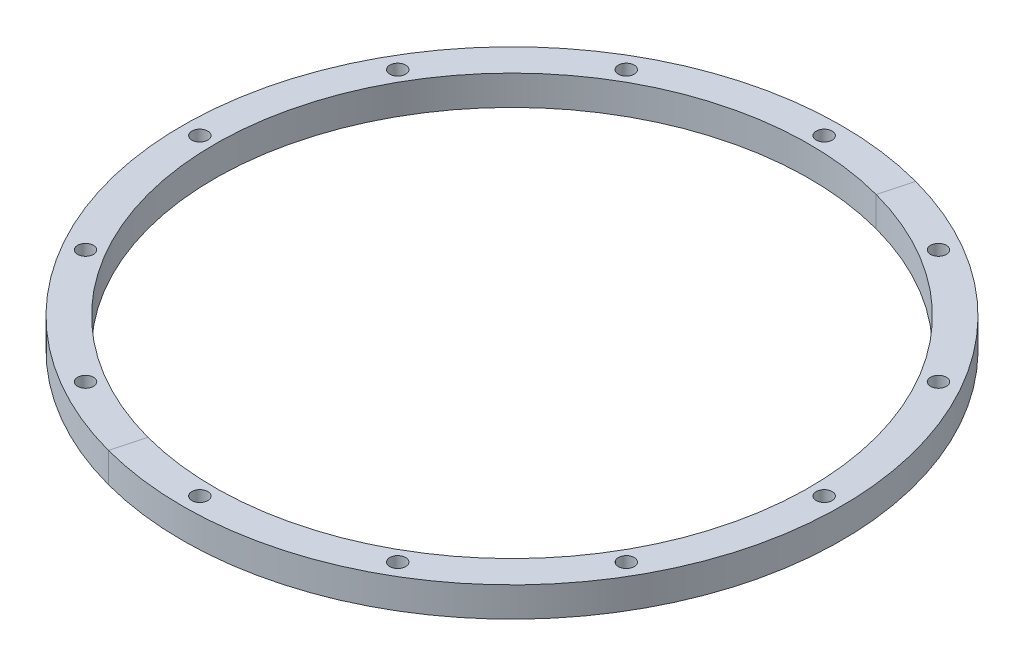
ISO-10303-21;
HEADER;
FILE_DESCRIPTION(('STEP AP214'),'2;1');
FILE_NAME('part.step','',(''),(''),'','','');
FILE_SCHEMA(('AUTOMOTIVE_DESIGN { 1 0 10303 214 1 1 1 1 }'));
ENDSEC;
DATA;
#1=APPLICATION_CONTEXT('core data for automotive mechanical design processes');
#2=APPLICATION_PROTOCOL_DEFINITION('international standard','automotive_design',2000,#1);
#3=PRODUCT_CONTEXT('',#1,'mechanical');
#4=PRODUCT('Part','Part','',(#3));
#5=PRODUCT_RELATED_PRODUCT_CATEGORY('part','',(#4));
#6=PRODUCT_DEFINITION_FORMATION('','',#4);
#7=PRODUCT_DEFINITION_CONTEXT('part definition',#1,'design');
#8=PRODUCT_DEFINITION('design','',#6,#7);
#9=PRODUCT_DEFINITION_SHAPE('','',#8);
#10=(LENGTH_UNIT() NAMED_UNIT(*) SI_UNIT(.MILLI.,.METRE.));
#11=(NAMED_UNIT(*) PLANE_ANGLE_UNIT() SI_UNIT($,.RADIAN.));
#12=(NAMED_UNIT(*) SI_UNIT($,.STERADIAN.) SOLID_ANGLE_UNIT());
#13=UNCERTAINTY_MEASURE_WITH_UNIT(LENGTH_MEASURE(1.E-05),#10,'distance_accuracy_value','');
#14=(GEOMETRIC_REPRESENTATION_CONTEXT(3) GLOBAL_UNCERTAINTY_ASSIGNED_CONTEXT((#13)) GLOBAL_UNIT_ASSIGNED_CONTEXT((#10,
#11,#12)) REPRESENTATION_CONTEXT('',''));
#15=CARTESIAN_POINT('',(0.,0.,0.));
#16=DIRECTION('',(0.,0.,1.));
#17=DIRECTION('',(1.,0.,0.));
#18=AXIS2_PLACEMENT_3D('',#15,#16,#17);
#19=CARTESIAN_POINT('',(0.,0.,0.));
#20=DIRECTION('',(0.965925826289068,0.,0.258819045102521));
#21=DIRECTION('',(0.258819045102521,0.,-0.965925826289068));
#22=AXIS2_PLACEMENT_3D('',#19,#20,#21);
#23=PLANE('',#22);
#24=DIRECTION('',(0.,-1.,0.));
#25=VECTOR('',#24,1.);
#26=CARTESIAN_POINT('',(-15.5291427061513,-200069.047495165,57.9555495773441));
#27=LINE('',#26,#25);
#28=CARTESIAN_POINT('',(-15.5291427061513,0.785000000007585,57.9555495773441));
#29=VERTEX_POINT('',#28);
#30=CARTESIAN_POINT('',(-15.5291427061513,6.78500000000781,57.9555495773441));
#31=VERTEX_POINT('',#30);
#32=EDGE_CURVE('E119',#29,#31,#27,.F.);
#33=ORIENTED_EDGE('',*,*,#32,.T.);
#34=DIRECTION('',(-0.258819045102521,0.,0.965925826289068));
#35=VECTOR('',#34,1.);
#36=CARTESIAN_POINT('',(-4.01923788646686,6.785,15.));
#37=LINE('',#36,#35);
#38=CARTESIAN_POINT('',(-17.2114664993177,6.78500000000781,64.234067448223));
#39=VERTEX_POINT('',#38);
#40=EDGE_CURVE('E102',#31,#39,#37,.T.);
#41=ORIENTED_EDGE('',*,*,#40,.T.);
#42=DIRECTION('',(0.,-1.,0.));
#43=VECTOR('',#42,1.);
#44=CARTESIAN_POINT('',(-17.2114664993177,-200069.047495165,64.234067448223));
#45=LINE('',#44,#43);
#46=CARTESIAN_POINT('',(-17.2114664993177,0.785000000007585,64.234067448223));
#47=VERTEX_POINT('',#46);
#48=EDGE_CURVE('E136',#39,#47,#45,.T.);
#49=ORIENTED_EDGE('',*,*,#48,.T.);
#50=DIRECTION('',(0.258819045102521,0.,-0.965925826289068));
#51=VECTOR('',#50,1.);
#52=CARTESIAN_POINT('',(-4.01923788646686,0.785,15.));
#53=LINE('',#52,#51);
#54=EDGE_CURVE('E142',#47,#29,#53,.T.);
#55=ORIENTED_EDGE('',*,*,#54,.T.);
#56=EDGE_LOOP('',(#33,#41,#49,#55));
#57=FACE_BOUND('',#56,.T.);
#58=ADVANCED_FACE('F56',(#57),#23,.T.);
#59=DIRECTION('',(0.,-1.,0.));
#60=VECTOR('',#59,1.);
#61=CARTESIAN_POINT('',(17.2114664993177,-200069.047495165,-64.234067448223));
#62=LINE('',#61,#60);
#63=CARTESIAN_POINT('',(17.2114664993177,0.785000000007585,-64.234067448223));
#64=VERTEX_POINT('',#63);
#65=CARTESIAN_POINT('',(17.2114664993177,6.78500000000781,-64.234067448223));
#66=VERTEX_POINT('',#65);
#67=EDGE_CURVE('E115',#64,#66,#62,.F.);
#68=ORIENTED_EDGE('',*,*,#67,.T.);
#69=CARTESIAN_POINT('',(15.5291427061513,6.78500000000781,-57.9555495773441));
#70=VERTEX_POINT('',#69);
#71=EDGE_CURVE('E100',#66,#70,#37,.T.);
#72=ORIENTED_EDGE('',*,*,#71,.T.);
#73=DIRECTION('',(0.,-1.,0.));
#74=VECTOR('',#73,1.);
#75=CARTESIAN_POINT('',(15.5291427061513,-200069.047495165,-57.9555495773441));
#76=LINE('',#75,#74);
#77=CARTESIAN_POINT('',(15.5291427061513,0.785000000007585,-57.9555495773441));
#78=VERTEX_POINT('',#77);
#79=EDGE_CURVE('E114',#70,#78,#76,.T.);
#80=ORIENTED_EDGE('',*,*,#79,.T.);
#81=EDGE_CURVE('E121',#78,#64,#53,.T.);
#82=ORIENTED_EDGE('',*,*,#81,.T.);
#83=EDGE_LOOP('',(#68,#72,#80,#82));
#84=FACE_BOUND('',#83,.T.);
#85=ADVANCED_FACE('F112',(#84),#23,.T.);
#86=CARTESIAN_POINT('',(-60.,6.785,0.));
#87=DIRECTION('',(0.,-1.,0.));
#88=DIRECTION('',(0.,0.,-1.));
#89=AXIS2_PLACEMENT_3D('',#86,#87,#88);
#90=PLANE('',#89);
#91=CARTESIAN_POINT('',(0.,6.785,-63.));
#92=DIRECTION('',(0.,1.,0.));
#93=DIRECTION('',(0.,0.,1.));
#94=AXIS2_PLACEMENT_3D('',#91,#92,#93);
#95=CIRCLE('',#94,1.6);
#96=CARTESIAN_POINT('',(0.,6.785,-61.4));
#97=VERTEX_POINT('',#96);
#98=EDGE_CURVE('E192',#97,#97,#95,.T.);
#99=ORIENTED_EDGE('',*,*,#98,.F.);
#100=EDGE_LOOP('',(#99));
#101=FACE_BOUND('',#100,.T.);
#102=CARTESIAN_POINT('',(-31.5000000000001,6.785,-54.5596004384196));
#103=DIRECTION('',(0.,1.,0.));
#104=DIRECTION('',(0.500000000000001,0.,0.866025403784438));
#105=AXIS2_PLACEMENT_3D('',#102,#103,#104);
#106=CIRCLE('',#105,1.6);
#107=CARTESIAN_POINT('',(-30.7000000000001,6.785,-53.1739597923645));
#108=VERTEX_POINT('',#107);
#109=EDGE_CURVE('E198',#108,#108,#106,.T.);
#110=ORIENTED_EDGE('',*,*,#109,.F.);
#111=EDGE_LOOP('',(#110));
#112=FACE_BOUND('',#111,.T.);
#113=CARTESIAN_POINT('',(-31.4999999999997,6.785,54.5596004384198));
#114=DIRECTION('',(0.,1.,0.));
#115=DIRECTION('',(0.499999999999995,0.,-0.866025403784442));
#116=AXIS2_PLACEMENT_3D('',#113,#114,#115);
#117=CIRCLE('',#116,1.6);
#118=CARTESIAN_POINT('',(-30.6999999999997,6.785,53.1739597923647));
#119=VERTEX_POINT('',#118);
#120=EDGE_CURVE('E13',#119,#119,#117,.T.);
#121=ORIENTED_EDGE('',*,*,#120,.F.);
#122=EDGE_LOOP('',(#121));
#123=FACE_BOUND('',#122,.T.);
#124=CARTESIAN_POINT('',(-54.5596004384195,6.785,31.5000000000003));
#125=DIRECTION('',(0.,1.,0.));
#126=DIRECTION('',(0.866025403784436,0.,-0.500000000000004));
#127=AXIS2_PLACEMENT_3D('',#124,#125,#126);
#128=CIRCLE('',#127,1.6);
#129=CARTESIAN_POINT('',(-53.1739597923644,6.785,30.7000000000002));
#130=VERTEX_POINT('',#129);
#131=EDGE_CURVE('E213',#130,#130,#128,.T.);
#132=ORIENTED_EDGE('',*,*,#131,.F.);
#133=EDGE_LOOP('',(#132));
#134=FACE_BOUND('',#133,.T.);
#135=CARTESIAN_POINT('',(-63.,6.785,2.19963324347117E-13));
#136=DIRECTION('',(0.,1.,0.));
#137=DIRECTION('',(1.,0.,0.));
#138=AXIS2_PLACEMENT_3D('',#135,#136,#137);
#139=CIRCLE('',#138,1.6);
#140=CARTESIAN_POINT('',(-61.4,6.785,2.14376954204968E-13));
#141=VERTEX_POINT('',#140);
#142=EDGE_CURVE('E221',#141,#141,#139,.T.);
#143=ORIENTED_EDGE('',*,*,#142,.F.);
#144=EDGE_LOOP('',(#143));
#145=FACE_BOUND('',#144,.T.);
#146=CARTESIAN_POINT('',(-54.5596004384197,6.785,-31.4999999999999));
#147=DIRECTION('',(0.,1.,0.));
#148=DIRECTION('',(0.86602540378444,0.,0.499999999999998));
#149=AXIS2_PLACEMENT_3D('',#146,#147,#148);
#150=CIRCLE('',#149,1.6);
#151=CARTESIAN_POINT('',(-53.1739597923646,6.785,-30.6999999999999));
#152=VERTEX_POINT('',#151);
#153=EDGE_CURVE('E228',#152,#152,#150,.T.);
#154=ORIENTED_EDGE('',*,*,#153,.F.);
#155=EDGE_LOOP('',(#154));
#156=FACE_BOUND('',#155,.T.);
#157=ORIENTED_EDGE('',*,*,#71,.F.);
#158=CARTESIAN_POINT('',(0.,6.78500000000781,0.));
#159=DIRECTION('',(0.,-1.,0.));
#160=DIRECTION('',(0.,0.,-1.));
#161=AXIS2_PLACEMENT_3D('',#158,#159,#160);
#162=CIRCLE('',#161,66.5);
#163=EDGE_CURVE('E75',#39,#66,#162,.T.);
#164=ORIENTED_EDGE('',*,*,#163,.F.);
#165=ORIENTED_EDGE('',*,*,#40,.F.);
#166=CARTESIAN_POINT('',(0.,6.78500000000781,0.));
#167=DIRECTION('',(0.,-1.,0.));
#168=DIRECTION('',(0.,0.,-1.));
#169=AXIS2_PLACEMENT_3D('',#166,#167,#168);
#170=CIRCLE('',#169,60.);
#171=EDGE_CURVE('E60',#31,#70,#170,.T.);
#172=ORIENTED_EDGE('',*,*,#171,.T.);
#173=EDGE_LOOP('',(#157,#164,#165,#172));
#174=FACE_BOUND('',#173,.T.);
#175=ADVANCED_FACE('F99',(#101,#112,#123,#134,#145,#156,#174),#90,.F.);
#176=CARTESIAN_POINT('',(0.,-200069.047495165,0.));
#177=DIRECTION('',(0.,-1.,0.));
#178=DIRECTION('',(0.,0.,-1.));
#179=AXIS2_PLACEMENT_3D('',#176,#177,#178);
#180=CYLINDRICAL_SURFACE('',#179,66.5);
#181=ORIENTED_EDGE('',*,*,#48,.F.);
#182=ORIENTED_EDGE('',*,*,#163,.T.);
#183=ORIENTED_EDGE('',*,*,#67,.F.);
#184=CARTESIAN_POINT('',(0.,0.785000000007585,0.));
#185=DIRECTION('',(0.,-1.,0.));
#186=DIRECTION('',(0.,0.,-1.));
#187=AXIS2_PLACEMENT_3D('',#184,#185,#186);
#188=CIRCLE('',#187,66.5);
#189=EDGE_CURVE('E128',#47,#64,#188,.T.);
#190=ORIENTED_EDGE('',*,*,#189,.F.);
#191=EDGE_LOOP('',(#181,#182,#183,#190));
#192=FACE_BOUND('',#191,.T.);
#193=ADVANCED_FACE('F148',(#192),#180,.T.);
#194=CARTESIAN_POINT('',(-60.,0.785,0.));
#195=DIRECTION('',(0.,1.,0.));
#196=DIRECTION('',(0.,0.,1.));
#197=AXIS2_PLACEMENT_3D('',#194,#195,#196);
#198=PLANE('',#197);
#199=CARTESIAN_POINT('',(0.,0.785000000007585,-63.));
#200=DIRECTION('',(0.,1.,0.));
#201=DIRECTION('',(0.,0.,1.));
#202=AXIS2_PLACEMENT_3D('',#199,#200,#201);
#203=CIRCLE('',#202,1.6);
#204=CARTESIAN_POINT('',(0.,0.785000000007585,-61.4));
#205=VERTEX_POINT('',#204);
#206=EDGE_CURVE('E108',#205,#205,#203,.T.);
#207=ORIENTED_EDGE('',*,*,#206,.T.);
#208=EDGE_LOOP('',(#207));
#209=FACE_BOUND('',#208,.T.);
#210=CARTESIAN_POINT('',(-31.5000000000001,0.785000000007585,-54.5596004384196));
#211=DIRECTION('',(0.,1.,0.));
#212=DIRECTION('',(0.500000000000001,0.,0.866025403784438));
#213=AXIS2_PLACEMENT_3D('',#210,#211,#212);
#214=CIRCLE('',#213,1.6);
#215=CARTESIAN_POINT('',(-30.7000000000001,0.785000000007585,-53.1739597923645));
#216=VERTEX_POINT('',#215);
#217=EDGE_CURVE('E194',#216,#216,#214,.T.);
#218=ORIENTED_EDGE('',*,*,#217,.T.);
#219=EDGE_LOOP('',(#218));
#220=FACE_BOUND('',#219,.T.);
#221=CARTESIAN_POINT('',(-31.4999999999997,0.785000000007585,54.5596004384198));
#222=DIRECTION('',(0.,1.,0.));
#223=DIRECTION('',(0.499999999999995,0.,-0.866025403784442));
#224=AXIS2_PLACEMENT_3D('',#221,#222,#223);
#225=CIRCLE('',#224,1.6);
#226=CARTESIAN_POINT('',(-30.6999999999997,0.785000000007585,53.1739597923647));
#227=VERTEX_POINT('',#226);
#228=EDGE_CURVE('E67',#227,#227,#225,.T.);
#229=ORIENTED_EDGE('',*,*,#228,.T.);
#230=EDGE_LOOP('',(#229));
#231=FACE_BOUND('',#230,.T.);
#232=CARTESIAN_POINT('',(-54.5596004384195,0.785000000007585,31.5000000000003));
#233=DIRECTION('',(0.,1.,0.));
#234=DIRECTION('',(0.866025403784436,0.,-0.500000000000004));
#235=AXIS2_PLACEMENT_3D('',#232,#233,#234);
#236=CIRCLE('',#235,1.6);
#237=CARTESIAN_POINT('',(-53.1739597923644,0.785000000007585,30.7000000000002));
#238=VERTEX_POINT('',#237);
#239=EDGE_CURVE('E218',#238,#238,#236,.T.);
#240=ORIENTED_EDGE('',*,*,#239,.T.);
#241=EDGE_LOOP('',(#240));
#242=FACE_BOUND('',#241,.T.);
#243=CARTESIAN_POINT('',(-63.,0.785000000007585,2.19963324347117E-13));
#244=DIRECTION('',(0.,1.,0.));
#245=DIRECTION('',(1.,0.,0.));
#246=AXIS2_PLACEMENT_3D('',#243,#244,#245);
#247=CIRCLE('',#246,1.6);
#248=CARTESIAN_POINT('',(-61.4,0.785000000007585,2.14376954204968E-13));
#249=VERTEX_POINT('',#248);
#250=EDGE_CURVE('E226',#249,#249,#247,.T.);
#251=ORIENTED_EDGE('',*,*,#250,.T.);
#252=EDGE_LOOP('',(#251));
#253=FACE_BOUND('',#252,.T.);
#254=CARTESIAN_POINT('',(-54.5596004384197,0.785000000007585,-31.4999999999999));
#255=DIRECTION('',(0.,1.,0.));
#256=DIRECTION('',(0.86602540378444,0.,0.499999999999998));
#257=AXIS2_PLACEMENT_3D('',#254,#255,#256);
#258=CIRCLE('',#257,1.6);
#259=CARTESIAN_POINT('',(-53.1739597923646,0.785000000007585,-30.6999999999999));
#260=VERTEX_POINT('',#259);
#261=EDGE_CURVE('E137',#260,#260,#258,.T.);
#262=ORIENTED_EDGE('',*,*,#261,.T.);
#263=EDGE_LOOP('',(#262));
#264=FACE_BOUND('',#263,.T.);
#265=ORIENTED_EDGE('',*,*,#54,.F.);
#266=ORIENTED_EDGE('',*,*,#189,.T.);
#267=ORIENTED_EDGE('',*,*,#81,.F.);
#268=CARTESIAN_POINT('',(0.,0.785000000007585,0.));
#269=DIRECTION('',(0.,-1.,0.));
#270=DIRECTION('',(0.,0.,-1.));
#271=AXIS2_PLACEMENT_3D('',#268,#269,#270);
#272=CIRCLE('',#271,60.);
#273=EDGE_CURVE('E109',#29,#78,#272,.T.);
#274=ORIENTED_EDGE('',*,*,#273,.F.);
#275=EDGE_LOOP('',(#265,#266,#267,#274));
#276=FACE_BOUND('',#275,.T.);
#277=ADVANCED_FACE('F147',(#209,#220,#231,#242,#253,#264,#276),#198,.F.);
#278=CARTESIAN_POINT('',(0.,-200069.047495165,0.));
#279=DIRECTION('',(0.,-1.,0.));
#280=DIRECTION('',(0.,0.,-1.));
#281=AXIS2_PLACEMENT_3D('',#278,#279,#280);
#282=CYLINDRICAL_SURFACE('',#281,60.);
#283=ORIENTED_EDGE('',*,*,#32,.F.);
#284=ORIENTED_EDGE('',*,*,#273,.T.);
#285=ORIENTED_EDGE('',*,*,#79,.F.);
#286=ORIENTED_EDGE('',*,*,#171,.F.);
#287=EDGE_LOOP('',(#283,#284,#285,#286));
#288=FACE_BOUND('',#287,.T.);
#289=ADVANCED_FACE('F58',(#288),#282,.F.);
#290=CARTESIAN_POINT('',(0.,0.785000000007585,-63.));
#291=DIRECTION('',(0.,1.,0.));
#292=DIRECTION('',(0.,0.,1.));
#293=AXIS2_PLACEMENT_3D('',#290,#291,#292);
#294=CYLINDRICAL_SURFACE('',#293,1.6);
#295=ORIENTED_EDGE('',*,*,#206,.F.);
#296=EDGE_LOOP('',(#295));
#297=FACE_BOUND('',#296,.T.);
#298=ORIENTED_EDGE('',*,*,#98,.T.);
#299=EDGE_LOOP('',(#298));
#300=FACE_BOUND('',#299,.T.);
#301=ADVANCED_FACE('F180',(#297,#300),#294,.F.);
#302=CARTESIAN_POINT('',(-31.5000000000001,0.785000000007585,-54.5596004384196));
#303=DIRECTION('',(0.,1.,0.));
#304=DIRECTION('',(0.,0.,1.));
#305=AXIS2_PLACEMENT_3D('',#302,#303,#304);
#306=CYLINDRICAL_SURFACE('',#305,1.6);
#307=ORIENTED_EDGE('',*,*,#217,.F.);
#308=EDGE_LOOP('',(#307));
#309=FACE_BOUND('',#308,.T.);
#310=ORIENTED_EDGE('',*,*,#109,.T.);
#311=EDGE_LOOP('',(#310));
#312=FACE_BOUND('',#311,.T.);
#313=ADVANCED_FACE('F176',(#309,#312),#306,.F.);
#314=CARTESIAN_POINT('',(-31.4999999999997,0.785000000007585,54.5596004384198));
#315=DIRECTION('',(0.,1.,0.));
#316=DIRECTION('',(0.,0.,1.));
#317=AXIS2_PLACEMENT_3D('',#314,#315,#316);
#318=CYLINDRICAL_SURFACE('',#317,1.6);
#319=ORIENTED_EDGE('',*,*,#228,.F.);
#320=EDGE_LOOP('',(#319));
#321=FACE_BOUND('',#320,.T.);
#322=ORIENTED_EDGE('',*,*,#120,.T.);
#323=EDGE_LOOP('',(#322));
#324=FACE_BOUND('',#323,.T.);
#325=ADVANCED_FACE('F172',(#321,#324),#318,.F.);
#326=CARTESIAN_POINT('',(-54.5596004384195,0.785000000007585,31.5000000000003));
#327=DIRECTION('',(0.,1.,0.));
#328=DIRECTION('',(0.,0.,1.));
#329=AXIS2_PLACEMENT_3D('',#326,#327,#328);
#330=CYLINDRICAL_SURFACE('',#329,1.6);
#331=ORIENTED_EDGE('',*,*,#239,.F.);
#332=EDGE_LOOP('',(#331));
#333=FACE_BOUND('',#332,.T.);
#334=ORIENTED_EDGE('',*,*,#131,.T.);
#335=EDGE_LOOP('',(#334));
#336=FACE_BOUND('',#335,.T.);
#337=ADVANCED_FACE('F168',(#333,#336),#330,.F.);
#338=CARTESIAN_POINT('',(-63.,0.785000000007585,2.19963324347117E-13));
#339=DIRECTION('',(0.,1.,0.));
#340=DIRECTION('',(0.,0.,1.));
#341=AXIS2_PLACEMENT_3D('',#338,#339,#340);
#342=CYLINDRICAL_SURFACE('',#341,1.6);
#343=ORIENTED_EDGE('',*,*,#250,.F.);
#344=EDGE_LOOP('',(#343));
#345=FACE_BOUND('',#344,.T.);
#346=ORIENTED_EDGE('',*,*,#142,.T.);
#347=EDGE_LOOP('',(#346));
#348=FACE_BOUND('',#347,.T.);
#349=ADVANCED_FACE('F164',(#345,#348),#342,.F.);
#350=CARTESIAN_POINT('',(-54.5596004384197,0.785000000007585,-31.4999999999999));
#351=DIRECTION('',(0.,1.,0.));
#352=DIRECTION('',(0.,0.,1.));
#353=AXIS2_PLACEMENT_3D('',#350,#351,#352);
#354=CYLINDRICAL_SURFACE('',#353,1.6);
#355=ORIENTED_EDGE('',*,*,#261,.F.);
#356=EDGE_LOOP('',(#355));
#357=FACE_BOUND('',#356,.T.);
#358=ORIENTED_EDGE('',*,*,#153,.T.);
#359=EDGE_LOOP('',(#358));
#360=FACE_BOUND('',#359,.T.);
#361=ADVANCED_FACE('F161',(#357,#360),#354,.F.);
#362=CLOSED_SHELL('',(#58,#85,#175,#193,#277,#289,#301,#313,#325,#337,#349,#361));
#363=MANIFOLD_SOLID_BREP('B2',#362);
#364=CARTESIAN_POINT('',(0.,0.,0.));
#365=DIRECTION('',(0.965925826289068,0.,0.258819045102521));
#366=DIRECTION('',(0.258819045102521,0.,-0.965925826289068));
#367=AXIS2_PLACEMENT_3D('',#364,#365,#366);
#368=PLANE('',#367);
#369=DIRECTION('',(0.,-1.,0.));
#370=VECTOR('',#369,1.);
#371=CARTESIAN_POINT('',(-15.5291427061513,-200069.047495165,57.9555495773441));
#372=LINE('',#371,#370);
#373=CARTESIAN_POINT('',(-15.5291427061513,0.785000000007585,57.9555495773441));
#374=VERTEX_POINT('',#373);
#375=CARTESIAN_POINT('',(-15.5291427061513,6.78500000000781,57.9555495773441));
#376=VERTEX_POINT('',#375);
#377=EDGE_CURVE('E375',#374,#376,#372,.F.);
#378=ORIENTED_EDGE('',*,*,#377,.F.);
#379=DIRECTION('',(0.258819045102521,0.,-0.965925826289068));
#380=VECTOR('',#379,1.);
#381=CARTESIAN_POINT('',(-4.01923788646686,0.785,15.));
#382=LINE('',#381,#380);
#383=CARTESIAN_POINT('',(-17.2114664993177,0.785000000007585,64.234067448223));
#384=VERTEX_POINT('',#383);
#385=EDGE_CURVE('E396',#384,#374,#382,.T.);
#386=ORIENTED_EDGE('',*,*,#385,.F.);
#387=DIRECTION('',(0.,-1.,0.));
#388=VECTOR('',#387,1.);
#389=CARTESIAN_POINT('',(-17.2114664993177,-200069.047495165,64.234067448223));
#390=LINE('',#389,#388);
#391=CARTESIAN_POINT('',(-17.2114664993177,6.78500000000781,64.234067448223));
#392=VERTEX_POINT('',#391);
#393=EDGE_CURVE('E329',#392,#384,#390,.T.);
#394=ORIENTED_EDGE('',*,*,#393,.F.);
#395=DIRECTION('',(-0.258819045102521,0.,0.965925826289068));
#396=VECTOR('',#395,1.);
#397=CARTESIAN_POINT('',(-4.01923788646686,6.785,15.));
#398=LINE('',#397,#396);
#399=EDGE_CURVE('E334',#376,#392,#398,.T.);
#400=ORIENTED_EDGE('',*,*,#399,.F.);
#401=EDGE_LOOP('',(#378,#386,#394,#400));
#402=FACE_BOUND('',#401,.T.);
#403=ADVANCED_FACE('F326',(#402),#368,.F.);
#404=DIRECTION('',(0.,-1.,0.));
#405=VECTOR('',#404,1.);
#406=CARTESIAN_POINT('',(17.2114664993177,-200069.047495165,-64.234067448223));
#407=LINE('',#406,#405);
#408=CARTESIAN_POINT('',(17.2114664993177,0.785000000007585,-64.234067448223));
#409=VERTEX_POINT('',#408);
#410=CARTESIAN_POINT('',(17.2114664993177,6.78500000000781,-64.234067448223));
#411=VERTEX_POINT('',#410);
#412=EDGE_CURVE('E398',#409,#411,#407,.F.);
#413=ORIENTED_EDGE('',*,*,#412,.F.);
#414=CARTESIAN_POINT('',(15.5291427061513,0.785000000007585,-57.9555495773441));
#415=VERTEX_POINT('',#414);
#416=EDGE_CURVE('E371',#415,#409,#382,.T.);
#417=ORIENTED_EDGE('',*,*,#416,.F.);
#418=DIRECTION('',(0.,-1.,0.));
#419=VECTOR('',#418,1.);
#420=CARTESIAN_POINT('',(15.5291427061513,-200069.047495165,-57.9555495773441));
#421=LINE('',#420,#419);
#422=CARTESIAN_POINT('',(15.5291427061513,6.78500000000781,-57.9555495773441));
#423=VERTEX_POINT('',#422);
#424=EDGE_CURVE('E369',#423,#415,#421,.T.);
#425=ORIENTED_EDGE('',*,*,#424,.F.);
#426=EDGE_CURVE('E54',#411,#423,#398,.T.);
#427=ORIENTED_EDGE('',*,*,#426,.F.);
#428=EDGE_LOOP('',(#413,#417,#425,#427));
#429=FACE_BOUND('',#428,.T.);
#430=ADVANCED_FACE('F370',(#429),#368,.F.);
#431=CARTESIAN_POINT('',(0.,-200069.047495165,0.));
#432=DIRECTION('',(0.,-1.,0.));
#433=DIRECTION('',(0.,0.,-1.));
#434=AXIS2_PLACEMENT_3D('',#431,#432,#433);
#435=CYLINDRICAL_SURFACE('',#434,66.5);
#436=CARTESIAN_POINT('',(0.,6.78500000000781,0.));
#437=DIRECTION('',(0.,-1.,0.));
#438=DIRECTION('',(0.,0.,-1.));
#439=AXIS2_PLACEMENT_3D('',#436,#437,#438);
#440=CIRCLE('',#439,66.5);
#441=EDGE_CURVE('E367',#411,#392,#440,.T.);
#442=ORIENTED_EDGE('',*,*,#441,.T.);
#443=ORIENTED_EDGE('',*,*,#393,.T.);
#444=CARTESIAN_POINT('',(0.,0.785000000007585,0.));
#445=DIRECTION('',(0.,-1.,0.));
#446=DIRECTION('',(0.,0.,-1.));
#447=AXIS2_PLACEMENT_3D('',#444,#445,#446);
#448=CIRCLE('',#447,66.5);
#449=EDGE_CURVE('E383',#409,#384,#448,.T.);
#450=ORIENTED_EDGE('',*,*,#449,.F.);
#451=ORIENTED_EDGE('',*,*,#412,.T.);
#452=EDGE_LOOP('',(#442,#443,#450,#451));
#453=FACE_BOUND('',#452,.T.);
#454=ADVANCED_FACE('F402',(#453),#435,.T.);
#455=CARTESIAN_POINT('',(31.4999999999993,0.785000000007585,-54.55960043842));
#456=DIRECTION('',(0.,1.,0.));
#457=DIRECTION('',(0.,0.,1.));
#458=AXIS2_PLACEMENT_3D('',#455,#456,#457);
#459=CYLINDRICAL_SURFACE('',#458,1.6);
#460=CARTESIAN_POINT('',(31.4999999999993,0.785000000007585,-54.55960043842));
#461=DIRECTION('',(0.,1.,0.));
#462=DIRECTION('',(-0.499999999999989,0.,0.866025403784445));
#463=AXIS2_PLACEMENT_3D('',#460,#461,#462);
#464=CIRCLE('',#463,1.6);
#465=CARTESIAN_POINT('',(30.6999999999993,0.785000000007585,-53.1739597923649));
#466=VERTEX_POINT('',#465);
#467=EDGE_CURVE('E472',#466,#466,#464,.T.);
#468=ORIENTED_EDGE('',*,*,#467,.F.);
#469=EDGE_LOOP('',(#468));
#470=FACE_BOUND('',#469,.T.);
#471=CARTESIAN_POINT('',(31.4999999999993,6.785,-54.55960043842));
#472=DIRECTION('',(0.,1.,0.));
#473=DIRECTION('',(-0.499999999999989,0.,0.866025403784445));
#474=AXIS2_PLACEMENT_3D('',#471,#472,#473);
#475=CIRCLE('',#474,1.6);
#476=CARTESIAN_POINT('',(30.6999999999993,6.785,-53.1739597923649));
#477=VERTEX_POINT('',#476);
#478=EDGE_CURVE('E477',#477,#477,#475,.T.);
#479=ORIENTED_EDGE('',*,*,#478,.T.);
#480=EDGE_LOOP('',(#479));
#481=FACE_BOUND('',#480,.T.);
#482=ADVANCED_FACE('F426',(#470,#481),#459,.F.);
#483=CARTESIAN_POINT('',(54.5596004384193,0.785000000007585,-31.5000000000006));
#484=DIRECTION('',(0.,1.,0.));
#485=DIRECTION('',(0.,0.,1.));
#486=AXIS2_PLACEMENT_3D('',#483,#484,#485);
#487=CYLINDRICAL_SURFACE('',#486,1.6);
#488=CARTESIAN_POINT('',(54.5596004384193,0.785000000007585,-31.5000000000006));
#489=DIRECTION('',(0.,1.,0.));
#490=DIRECTION('',(-0.866025403784433,0.,0.50000000000001));
#491=AXIS2_PLACEMENT_3D('',#488,#489,#490);
#492=CIRCLE('',#491,1.6);
#493=CARTESIAN_POINT('',(53.1739597923642,0.785000000007585,-30.7000000000006));
#494=VERTEX_POINT('',#493);
#495=EDGE_CURVE('E464',#494,#494,#492,.T.);
#496=ORIENTED_EDGE('',*,*,#495,.F.);
#497=EDGE_LOOP('',(#496));
#498=FACE_BOUND('',#497,.T.);
#499=CARTESIAN_POINT('',(54.5596004384193,6.785,-31.5000000000006));
#500=DIRECTION('',(0.,1.,0.));
#501=DIRECTION('',(-0.866025403784433,0.,0.50000000000001));
#502=AXIS2_PLACEMENT_3D('',#499,#500,#501);
#503=CIRCLE('',#502,1.6);
#504=CARTESIAN_POINT('',(53.1739597923642,6.785,-30.7000000000006));
#505=VERTEX_POINT('',#504);
#506=EDGE_CURVE('E467',#505,#505,#503,.T.);
#507=ORIENTED_EDGE('',*,*,#506,.T.);
#508=EDGE_LOOP('',(#507));
#509=FACE_BOUND('',#508,.T.);
#510=ADVANCED_FACE('F430',(#498,#509),#487,.F.);
#511=CARTESIAN_POINT('',(63.,0.785000000007585,-6.59889973041352E-13));
#512=DIRECTION('',(0.,1.,0.));
#513=DIRECTION('',(0.,0.,1.));
#514=AXIS2_PLACEMENT_3D('',#511,#512,#513);
#515=CYLINDRICAL_SURFACE('',#514,1.6);
#516=CARTESIAN_POINT('',(63.,0.785000000007585,-6.59889973041352E-13));
#517=DIRECTION('',(0.,1.,0.));
#518=DIRECTION('',(-1.,0.,0.));
#519=AXIS2_PLACEMENT_3D('',#516,#517,#518);
#520=CIRCLE('',#519,1.6);
#521=CARTESIAN_POINT('',(61.4,0.785000000007585,-6.43130862614905E-13));
#522=VERTEX_POINT('',#521);
#523=EDGE_CURVE('E460',#522,#522,#520,.T.);
#524=ORIENTED_EDGE('',*,*,#523,.F.);
#525=EDGE_LOOP('',(#524));
#526=FACE_BOUND('',#525,.T.);
#527=CARTESIAN_POINT('',(63.,6.785,-6.59889973041352E-13));
#528=DIRECTION('',(0.,1.,0.));
#529=DIRECTION('',(-1.,0.,0.));
#530=AXIS2_PLACEMENT_3D('',#527,#528,#529);
#531=CIRCLE('',#530,1.6);
#532=CARTESIAN_POINT('',(61.4,6.785,-6.43130862614905E-13));
#533=VERTEX_POINT('',#532);
#534=EDGE_CURVE('E389',#533,#533,#531,.T.);
#535=ORIENTED_EDGE('',*,*,#534,.T.);
#536=EDGE_LOOP('',(#535));
#537=FACE_BOUND('',#536,.T.);
#538=ADVANCED_FACE('F437',(#526,#537),#515,.F.);
#539=CARTESIAN_POINT('',(54.5596004384199,0.785000000007585,31.4999999999995));
#540=DIRECTION('',(0.,1.,0.));
#541=DIRECTION('',(0.,0.,1.));
#542=AXIS2_PLACEMENT_3D('',#539,#540,#541);
#543=CYLINDRICAL_SURFACE('',#542,1.6);
#544=CARTESIAN_POINT('',(54.5596004384199,0.785000000007585,31.4999999999995));
#545=DIRECTION('',(0.,1.,0.));
#546=DIRECTION('',(-0.866025403784443,0.,-0.499999999999992));
#547=AXIS2_PLACEMENT_3D('',#544,#545,#546);
#548=CIRCLE('',#547,1.6);
#549=CARTESIAN_POINT('',(53.1739597923648,0.785000000007585,30.6999999999995));
#550=VERTEX_POINT('',#549);
#551=EDGE_CURVE('E488',#550,#550,#548,.T.);
#552=ORIENTED_EDGE('',*,*,#551,.F.);
#553=EDGE_LOOP('',(#552));
#554=FACE_BOUND('',#553,.T.);
#555=CARTESIAN_POINT('',(54.5596004384199,6.785,31.4999999999995));
#556=DIRECTION('',(0.,1.,0.));
#557=DIRECTION('',(-0.866025403784443,0.,-0.499999999999992));
#558=AXIS2_PLACEMENT_3D('',#555,#556,#557);
#559=CIRCLE('',#558,1.6);
#560=CARTESIAN_POINT('',(53.1739597923648,6.785,30.6999999999995));
#561=VERTEX_POINT('',#560);
#562=EDGE_CURVE('E465',#561,#561,#559,.T.);
#563=ORIENTED_EDGE('',*,*,#562,.T.);
#564=EDGE_LOOP('',(#563));
#565=FACE_BOUND('',#564,.T.);
#566=ADVANCED_FACE('F448',(#554,#565),#543,.F.);
#567=CARTESIAN_POINT('',(31.5000000000005,0.785000000007585,54.5596004384194));
#568=DIRECTION('',(0.,1.,0.));
#569=DIRECTION('',(0.,0.,1.));
#570=AXIS2_PLACEMENT_3D('',#567,#568,#569);
#571=CYLINDRICAL_SURFACE('',#570,1.6);
#572=CARTESIAN_POINT('',(31.5000000000005,0.785000000007585,54.5596004384194));
#573=DIRECTION('',(0.,1.,0.));
#574=DIRECTION('',(-0.500000000000007,0.,-0.866025403784435));
#575=AXIS2_PLACEMENT_3D('',#572,#573,#574);
#576=CIRCLE('',#575,1.6);
#577=CARTESIAN_POINT('',(30.7000000000004,0.785000000007585,53.1739597923643));
#578=VERTEX_POINT('',#577);
#579=EDGE_CURVE('E482',#578,#578,#576,.T.);
#580=ORIENTED_EDGE('',*,*,#579,.F.);
#581=EDGE_LOOP('',(#580));
#582=FACE_BOUND('',#581,.T.);
#583=CARTESIAN_POINT('',(31.5000000000005,6.785,54.5596004384194));
#584=DIRECTION('',(0.,1.,0.));
#585=DIRECTION('',(-0.500000000000007,0.,-0.866025403784435));
#586=AXIS2_PLACEMENT_3D('',#583,#584,#585);
#587=CIRCLE('',#586,1.6);
#588=CARTESIAN_POINT('',(30.7000000000004,6.785,53.1739597923643));
#589=VERTEX_POINT('',#588);
#590=EDGE_CURVE('E485',#589,#589,#587,.T.);
#591=ORIENTED_EDGE('',*,*,#590,.T.);
#592=EDGE_LOOP('',(#591));
#593=FACE_BOUND('',#592,.T.);
#594=ADVANCED_FACE('F444',(#582,#593),#571,.F.);
#595=CARTESIAN_POINT('',(0.,0.785000000007585,63.));
#596=DIRECTION('',(0.,1.,0.));
#597=DIRECTION('',(0.,0.,1.));
#598=AXIS2_PLACEMENT_3D('',#595,#596,#597);
#599=CYLINDRICAL_SURFACE('',#598,1.6);
#600=CARTESIAN_POINT('',(0.,0.785000000007585,63.));
#601=DIRECTION('',(0.,1.,0.));
#602=DIRECTION('',(0.,0.,-1.));
#603=AXIS2_PLACEMENT_3D('',#600,#601,#602);
#604=CIRCLE('',#603,1.6);
#605=CARTESIAN_POINT('',(0.,0.785000000007585,61.4));
#606=VERTEX_POINT('',#605);
#607=EDGE_CURVE('E381',#606,#606,#604,.T.);
#608=ORIENTED_EDGE('',*,*,#607,.F.);
#609=EDGE_LOOP('',(#608));
#610=FACE_BOUND('',#609,.T.);
#611=CARTESIAN_POINT('',(0.,6.785,63.));
#612=DIRECTION('',(0.,1.,0.));
#613=DIRECTION('',(0.,0.,-1.));
#614=AXIS2_PLACEMENT_3D('',#611,#612,#613);
#615=CIRCLE('',#614,1.6);
#616=CARTESIAN_POINT('',(0.,6.785,61.4));
#617=VERTEX_POINT('',#616);
#618=EDGE_CURVE('E386',#617,#617,#615,.T.);
#619=ORIENTED_EDGE('',*,*,#618,.T.);
#620=EDGE_LOOP('',(#619));
#621=FACE_BOUND('',#620,.T.);
#622=ADVANCED_FACE('F414',(#610,#621),#599,.F.);
#623=CARTESIAN_POINT('',(-60.,6.785,0.));
#624=DIRECTION('',(0.,-1.,0.));
#625=DIRECTION('',(0.,0.,-1.));
#626=AXIS2_PLACEMENT_3D('',#623,#624,#625);
#627=PLANE('',#626);
#628=ORIENTED_EDGE('',*,*,#618,.F.);
#629=EDGE_LOOP('',(#628));
#630=FACE_BOUND('',#629,.T.);
#631=ORIENTED_EDGE('',*,*,#590,.F.);
#632=EDGE_LOOP('',(#631));
#633=FACE_BOUND('',#632,.T.);
#634=ORIENTED_EDGE('',*,*,#562,.F.);
#635=EDGE_LOOP('',(#634));
#636=FACE_BOUND('',#635,.T.);
#637=ORIENTED_EDGE('',*,*,#534,.F.);
#638=EDGE_LOOP('',(#637));
#639=FACE_BOUND('',#638,.T.);
#640=ORIENTED_EDGE('',*,*,#506,.F.);
#641=EDGE_LOOP('',(#640));
#642=FACE_BOUND('',#641,.T.);
#643=ORIENTED_EDGE('',*,*,#478,.F.);
#644=EDGE_LOOP('',(#643));
#645=FACE_BOUND('',#644,.T.);
#646=ORIENTED_EDGE('',*,*,#441,.F.);
#647=ORIENTED_EDGE('',*,*,#426,.T.);
#648=CARTESIAN_POINT('',(0.,6.78500000000781,0.));
#649=DIRECTION('',(0.,-1.,0.));
#650=DIRECTION('',(0.,0.,-1.));
#651=AXIS2_PLACEMENT_3D('',#648,#649,#650);
#652=CIRCLE('',#651,60.);
#653=EDGE_CURVE('E365',#423,#376,#652,.T.);
#654=ORIENTED_EDGE('',*,*,#653,.T.);
#655=ORIENTED_EDGE('',*,*,#399,.T.);
#656=EDGE_LOOP('',(#646,#647,#654,#655));
#657=FACE_BOUND('',#656,.T.);
#658=ADVANCED_FACE('F363',(#630,#633,#636,#639,#642,#645,#657),#627,.F.);
#659=CARTESIAN_POINT('',(-60.,0.785,0.));
#660=DIRECTION('',(0.,1.,0.));
#661=DIRECTION('',(0.,0.,1.));
#662=AXIS2_PLACEMENT_3D('',#659,#660,#661);
#663=PLANE('',#662);
#664=ORIENTED_EDGE('',*,*,#607,.T.);
#665=EDGE_LOOP('',(#664));
#666=FACE_BOUND('',#665,.T.);
#667=ORIENTED_EDGE('',*,*,#579,.T.);
#668=EDGE_LOOP('',(#667));
#669=FACE_BOUND('',#668,.T.);
#670=ORIENTED_EDGE('',*,*,#551,.T.);
#671=EDGE_LOOP('',(#670));
#672=FACE_BOUND('',#671,.T.);
#673=ORIENTED_EDGE('',*,*,#523,.T.);
#674=EDGE_LOOP('',(#673));
#675=FACE_BOUND('',#674,.T.);
#676=ORIENTED_EDGE('',*,*,#495,.T.);
#677=EDGE_LOOP('',(#676));
#678=FACE_BOUND('',#677,.T.);
#679=ORIENTED_EDGE('',*,*,#467,.T.);
#680=EDGE_LOOP('',(#679));
#681=FACE_BOUND('',#680,.T.);
#682=ORIENTED_EDGE('',*,*,#449,.T.);
#683=ORIENTED_EDGE('',*,*,#385,.T.);
#684=CARTESIAN_POINT('',(0.,0.785000000007585,0.));
#685=DIRECTION('',(0.,-1.,0.));
#686=DIRECTION('',(0.,0.,-1.));
#687=AXIS2_PLACEMENT_3D('',#684,#685,#686);
#688=CIRCLE('',#687,60.);
#689=EDGE_CURVE('E380',#415,#374,#688,.T.);
#690=ORIENTED_EDGE('',*,*,#689,.F.);
#691=ORIENTED_EDGE('',*,*,#416,.T.);
#692=EDGE_LOOP('',(#682,#683,#690,#691));
#693=FACE_BOUND('',#692,.T.);
#694=ADVANCED_FACE('F405',(#666,#669,#672,#675,#678,#681,#693),#663,.F.);
#695=CARTESIAN_POINT('',(0.,-200069.047495165,0.));
#696=DIRECTION('',(0.,-1.,0.));
#697=DIRECTION('',(0.,0.,-1.));
#698=AXIS2_PLACEMENT_3D('',#695,#696,#697);
#699=CYLINDRICAL_SURFACE('',#698,60.);
#700=ORIENTED_EDGE('',*,*,#689,.T.);
#701=ORIENTED_EDGE('',*,*,#377,.T.);
#702=ORIENTED_EDGE('',*,*,#653,.F.);
#703=ORIENTED_EDGE('',*,*,#424,.T.);
#704=EDGE_LOOP('',(#700,#701,#702,#703));
#705=FACE_BOUND('',#704,.T.);
#706=ADVANCED_FACE('F378',(#705),#699,.F.);
#707=CLOSED_SHELL('',(#403,#430,#454,#482,#510,#538,#566,#594,#622,#658,#694,#706));
#708=MANIFOLD_SOLID_BREP('B7',#707);
#709=ADVANCED_BREP_SHAPE_REPRESENTATION('',(#18,#363,#708),#14);
#710=SHAPE_DEFINITION_REPRESENTATION(#9,#709);
ENDSEC;
END-ISO-10303-21;
